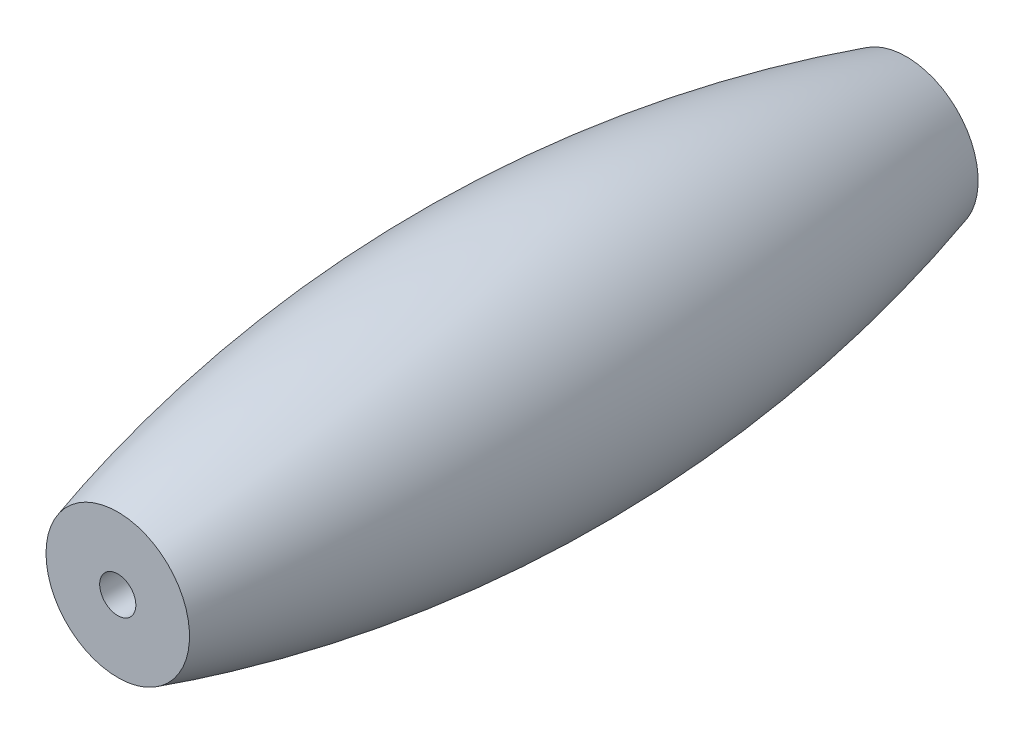
ISO-10303-21;
HEADER;
FILE_DESCRIPTION(('STEP AP214'),'2;1');
FILE_NAME('part.step','',(''),(''),'','','');
FILE_SCHEMA(('AUTOMOTIVE_DESIGN { 1 0 10303 214 1 1 1 1 }'));
ENDSEC;
DATA;
#1=APPLICATION_CONTEXT('core data for automotive mechanical design processes');
#2=APPLICATION_PROTOCOL_DEFINITION('international standard','automotive_design',2000,#1);
#3=PRODUCT_CONTEXT('',#1,'mechanical');
#4=PRODUCT('Part','Part','',(#3));
#5=PRODUCT_RELATED_PRODUCT_CATEGORY('part','',(#4));
#6=PRODUCT_DEFINITION_FORMATION('','',#4);
#7=PRODUCT_DEFINITION_CONTEXT('part definition',#1,'design');
#8=PRODUCT_DEFINITION('design','',#6,#7);
#9=PRODUCT_DEFINITION_SHAPE('','',#8);
#10=(LENGTH_UNIT() NAMED_UNIT(*) SI_UNIT(.MILLI.,.METRE.));
#11=(NAMED_UNIT(*) PLANE_ANGLE_UNIT() SI_UNIT($,.RADIAN.));
#12=(NAMED_UNIT(*) SI_UNIT($,.STERADIAN.) SOLID_ANGLE_UNIT());
#13=UNCERTAINTY_MEASURE_WITH_UNIT(LENGTH_MEASURE(1.E-05),#10,'distance_accuracy_value','');
#14=(GEOMETRIC_REPRESENTATION_CONTEXT(3) GLOBAL_UNCERTAINTY_ASSIGNED_CONTEXT((#13)) GLOBAL_UNIT_ASSIGNED_CONTEXT((#10,
#11,#12)) REPRESENTATION_CONTEXT('',''));
#15=CARTESIAN_POINT('',(0.,0.,0.));
#16=DIRECTION('',(0.,0.,1.));
#17=DIRECTION('',(1.,0.,0.));
#18=AXIS2_PLACEMENT_3D('',#15,#16,#17);
#19=CARTESIAN_POINT('',(0.,0.,27.25));
#20=DIRECTION('',(0.,0.,-1.));
#21=DIRECTION('',(-1.,0.,0.));
#22=AXIS2_PLACEMENT_3D('',#19,#20,#21);
#23=PLANE('',#22);
#24=CARTESIAN_POINT('',(0.,0.,27.25));
#25=DIRECTION('',(0.,0.,1.));
#26=DIRECTION('',(1.,0.,0.));
#27=AXIS2_PLACEMENT_3D('',#24,#25,#26);
#28=CIRCLE('',#27,1.25);
#29=CARTESIAN_POINT('',(1.25,0.,27.25));
#30=VERTEX_POINT('',#29);
#31=EDGE_CURVE('E48',#30,#30,#28,.T.);
#32=ORIENTED_EDGE('',*,*,#31,.F.);
#33=EDGE_LOOP('',(#32));
#34=FACE_BOUND('',#33,.T.);
#35=CARTESIAN_POINT('',(0.,0.,27.25));
#36=DIRECTION('',(0.,0.,-1.));
#37=DIRECTION('',(-1.,0.,0.));
#38=AXIS2_PLACEMENT_3D('',#35,#36,#37);
#39=CIRCLE('',#38,4.95889698427383);
#40=CARTESIAN_POINT('',(-4.95889698427382,0.,27.25));
#41=VERTEX_POINT('',#40);
#42=EDGE_CURVE('E10',#41,#41,#39,.T.);
#43=ORIENTED_EDGE('',*,*,#42,.F.);
#44=EDGE_LOOP('',(#43));
#45=FACE_BOUND('',#44,.T.);
#46=ADVANCED_FACE('F34',(#34,#45),#23,.F.);
#47=CARTESIAN_POINT('',(0.,0.,0.));
#48=DIRECTION('',(0.,0.,-1.));
#49=DIRECTION('',(-1.,0.,0.));
#50=AXIS2_PLACEMENT_3D('',#47,#48,#49);
#51=DEGENERATE_TOROIDAL_SURFACE('',#50,88.6018567782689,97.4483306404741,.F.);
#52=CARTESIAN_POINT('',(0.,0.,-27.25));
#53=DIRECTION('',(0.,0.,-1.));
#54=DIRECTION('',(-1.,0.,0.));
#55=AXIS2_PLACEMENT_3D('',#52,#53,#54);
#56=CIRCLE('',#55,4.95889698427384);
#57=CARTESIAN_POINT('',(-4.95889698427385,0.,-27.25));
#58=VERTEX_POINT('',#57);
#59=EDGE_CURVE('E40',#58,#58,#56,.T.);
#60=ORIENTED_EDGE('',*,*,#59,.F.);
#61=EDGE_LOOP('',(#60));
#62=FACE_BOUND('',#61,.T.);
#63=ORIENTED_EDGE('',*,*,#42,.T.);
#64=EDGE_LOOP('',(#63));
#65=FACE_BOUND('',#64,.T.);
#66=ADVANCED_FACE('F58',(#62,#65),#51,.F.);
#67=CARTESIAN_POINT('',(0.,0.,-27.25));
#68=DIRECTION('',(0.,0.,1.));
#69=DIRECTION('',(1.,0.,0.));
#70=AXIS2_PLACEMENT_3D('',#67,#68,#69);
#71=PLANE('',#70);
#72=CARTESIAN_POINT('',(0.,0.,-27.25));
#73=DIRECTION('',(0.,0.,1.));
#74=DIRECTION('',(1.,0.,0.));
#75=AXIS2_PLACEMENT_3D('',#72,#73,#74);
#76=CIRCLE('',#75,1.25);
#77=CARTESIAN_POINT('',(1.25,0.,-27.25));
#78=VERTEX_POINT('',#77);
#79=EDGE_CURVE('E44',#78,#78,#76,.T.);
#80=ORIENTED_EDGE('',*,*,#79,.T.);
#81=EDGE_LOOP('',(#80));
#82=FACE_BOUND('',#81,.T.);
#83=ORIENTED_EDGE('',*,*,#59,.T.);
#84=EDGE_LOOP('',(#83));
#85=FACE_BOUND('',#84,.T.);
#86=ADVANCED_FACE('F62',(#82,#85),#71,.F.);
#87=CARTESIAN_POINT('',(0.,0.,-27.25));
#88=DIRECTION('',(0.,0.,1.));
#89=DIRECTION('',(1.,0.,0.));
#90=AXIS2_PLACEMENT_3D('',#87,#88,#89);
#91=CYLINDRICAL_SURFACE('',#90,1.25);
#92=CARTESIAN_POINT('',(1.25,0.,-27.25));
#93=CARTESIAN_POINT('',(1.25,0.,-26.6822916666667));
#94=CARTESIAN_POINT('',(1.25,0.,-26.1145833333333));
#95=CARTESIAN_POINT('',(1.25,0.,-24.9791666666667));
#96=CARTESIAN_POINT('',(1.25,0.,-24.4114583333333));
#97=CARTESIAN_POINT('',(1.25,0.,-23.2760416666667));
#98=CARTESIAN_POINT('',(1.25,0.,-22.7083333333333));
#99=CARTESIAN_POINT('',(1.25,0.,-21.5729166666667));
#100=CARTESIAN_POINT('',(1.25,0.,-21.0052083333333));
#101=CARTESIAN_POINT('',(1.25,0.,-19.8697916666667));
#102=CARTESIAN_POINT('',(1.25,0.,-19.3020833333333));
#103=CARTESIAN_POINT('',(1.25,0.,-18.1666666666667));
#104=CARTESIAN_POINT('',(1.25,0.,-17.5989583333333));
#105=CARTESIAN_POINT('',(1.25,0.,-16.4635416666667));
#106=CARTESIAN_POINT('',(1.25,0.,-15.8958333333333));
#107=CARTESIAN_POINT('',(1.25,0.,-14.7604166666667));
#108=CARTESIAN_POINT('',(1.25,0.,-14.1927083333333));
#109=CARTESIAN_POINT('',(1.25,0.,-13.0572916666667));
#110=CARTESIAN_POINT('',(1.25,0.,-12.4895833333333));
#111=CARTESIAN_POINT('',(1.25,0.,-11.3541666666667));
#112=CARTESIAN_POINT('',(1.25,0.,-10.7864583333333));
#113=CARTESIAN_POINT('',(1.25,0.,-9.65104166666667));
#114=CARTESIAN_POINT('',(1.25,0.,-9.08333333333334));
#115=CARTESIAN_POINT('',(1.25,0.,-7.94791666666667));
#116=CARTESIAN_POINT('',(1.25,0.,-7.38020833333334));
#117=CARTESIAN_POINT('',(1.25,0.,-6.24479166666667));
#118=CARTESIAN_POINT('',(1.25,0.,-5.67708333333334));
#119=CARTESIAN_POINT('',(1.25,0.,-4.54166666666667));
#120=CARTESIAN_POINT('',(1.25,0.,-3.97395833333334));
#121=CARTESIAN_POINT('',(1.25,0.,-2.83854166666667));
#122=CARTESIAN_POINT('',(1.25,0.,-2.27083333333334));
#123=CARTESIAN_POINT('',(1.25,0.,-1.13541666666667));
#124=CARTESIAN_POINT('',(1.25,0.,-0.56770833333334));
#125=CARTESIAN_POINT('',(1.25,0.,0.567708333333326));
#126=CARTESIAN_POINT('',(1.25,0.,1.13541666666666));
#127=CARTESIAN_POINT('',(1.25,0.,2.27083333333333));
#128=CARTESIAN_POINT('',(1.25,0.,2.83854166666666));
#129=CARTESIAN_POINT('',(1.25,0.,3.97395833333333));
#130=CARTESIAN_POINT('',(1.25,0.,4.54166666666666));
#131=CARTESIAN_POINT('',(1.25,0.,5.67708333333333));
#132=CARTESIAN_POINT('',(1.25,0.,6.24479166666666));
#133=CARTESIAN_POINT('',(1.25,0.,7.38020833333333));
#134=CARTESIAN_POINT('',(1.25,0.,7.94791666666666));
#135=CARTESIAN_POINT('',(1.25,0.,9.08333333333333));
#136=CARTESIAN_POINT('',(1.25,0.,9.65104166666666));
#137=CARTESIAN_POINT('',(1.25,0.,10.7864583333333));
#138=CARTESIAN_POINT('',(1.25,0.,11.3541666666667));
#139=CARTESIAN_POINT('',(1.25,0.,12.4895833333333));
#140=CARTESIAN_POINT('',(1.25,0.,13.0572916666667));
#141=CARTESIAN_POINT('',(1.25,0.,14.1927083333333));
#142=CARTESIAN_POINT('',(1.25,0.,14.7604166666667));
#143=CARTESIAN_POINT('',(1.25,0.,15.8958333333333));
#144=CARTESIAN_POINT('',(1.25,0.,16.4635416666667));
#145=CARTESIAN_POINT('',(1.25,0.,17.5989583333333));
#146=CARTESIAN_POINT('',(1.25,0.,18.1666666666667));
#147=CARTESIAN_POINT('',(1.25,0.,19.3020833333333));
#148=CARTESIAN_POINT('',(1.25,0.,19.8697916666667));
#149=CARTESIAN_POINT('',(1.25,0.,21.0052083333333));
#150=CARTESIAN_POINT('',(1.25,0.,21.5729166666667));
#151=CARTESIAN_POINT('',(1.25,0.,22.7083333333333));
#152=CARTESIAN_POINT('',(1.25,0.,23.2760416666667));
#153=CARTESIAN_POINT('',(1.25,0.,24.4114583333333));
#154=CARTESIAN_POINT('',(1.25,0.,24.9791666666667));
#155=CARTESIAN_POINT('',(1.25,0.,26.1145833333333));
#156=CARTESIAN_POINT('',(1.25,0.,26.6822916666667));
#157=CARTESIAN_POINT('',(1.25,0.,27.25));
#158=B_SPLINE_CURVE_WITH_KNOTS('',3,(#92,#93,#94,#95,#96,#97,#98,#99,#100,#101,#102,#103,#104,
#105,#106,#107,#108,#109,#110,#111,#112,#113,#114,#115,#116,#117,#118,#119,#120,#121,#122,#123,
#124,#125,#126,#127,#128,#129,#130,#131,#132,#133,#134,#135,#136,#137,#138,#139,#140,#141,#142,
#143,#144,#145,#146,#147,#148,#149,#150,#151,#152,#153,#154,#155,#156,#157),.UNSPECIFIED.,.F.,
.F.,(4,2,2,2,2,2,2,2,2,2,2,2,2,2,2,2,2,2,2,2,2,2,2,2,2,2,2,2,2,2,2,2,4),(0.,1.703125,3.40625,
5.109375,6.8125,8.515625,10.21875,11.921875,13.625,15.328125,17.03125,18.734375,20.4375,
22.140625,23.84375,25.546875,27.25,28.953125,30.65625,32.359375,34.0625,35.765625,37.46875,
39.171875,40.875,42.578125,44.28125,45.984375,47.6875,49.390625,51.09375,52.796875,54.5),.UNSPECIFIED.);
#159=EDGE_CURVE('BSEAM54',#78,#30,#158,.T.);
#160=ORIENTED_EDGE('',*,*,#79,.F.);
#161=ORIENTED_EDGE('',*,*,#31,.T.);
#162=ORIENTED_EDGE('',*,*,#159,.T.);
#163=ORIENTED_EDGE('',*,*,#159,.F.);
#164=EDGE_LOOP('',(#160,#162,#161,#163));
#165=FACE_BOUND('',#164,.T.);
#166=ADVANCED_FACE('F54',(#165),#91,.F.);
#167=CLOSED_SHELL('',(#46,#66,#86,#166));
#168=MANIFOLD_SOLID_BREP('B2',#167);
#169=ADVANCED_BREP_SHAPE_REPRESENTATION('',(#18,#168),#14);
#170=SHAPE_DEFINITION_REPRESENTATION(#9,#169);
ENDSEC;
END-ISO-10303-21;
